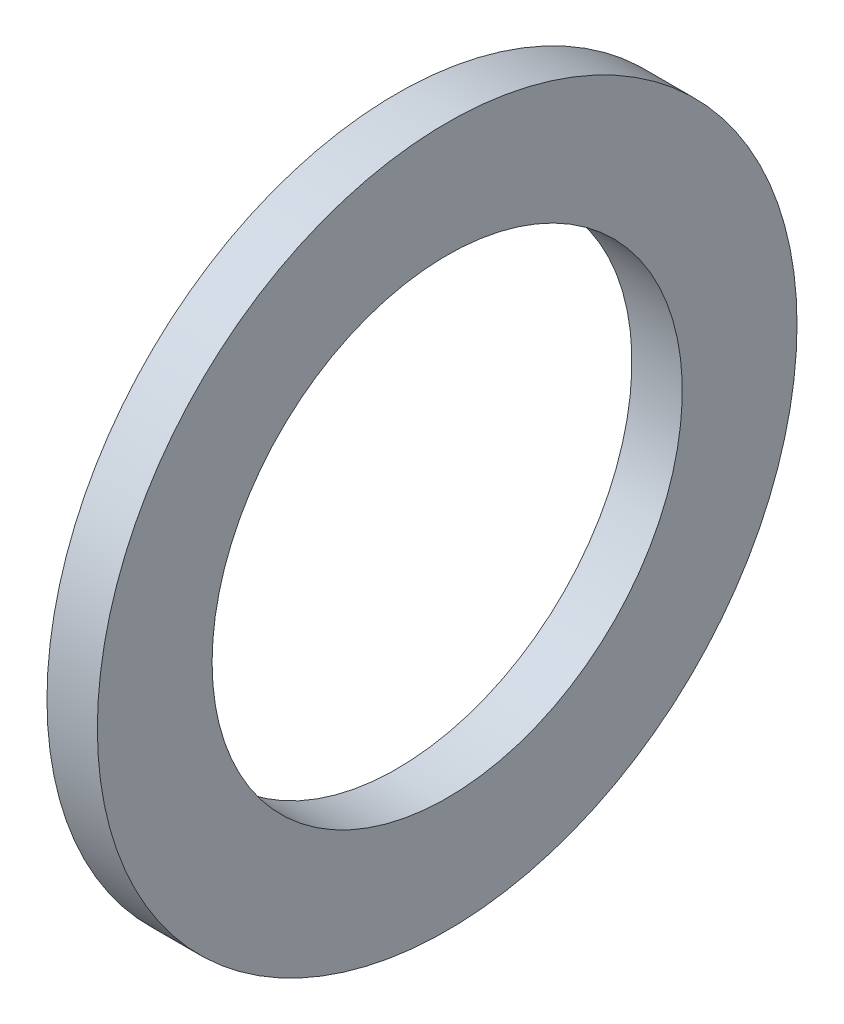
ISO-10303-21;
HEADER;
FILE_DESCRIPTION(('STEP AP214'),'2;1');
FILE_NAME('part.step','',(''),(''),'','','');
FILE_SCHEMA(('AUTOMOTIVE_DESIGN { 1 0 10303 214 1 1 1 1 }'));
ENDSEC;
DATA;
#1=APPLICATION_CONTEXT('core data for automotive mechanical design processes');
#2=APPLICATION_PROTOCOL_DEFINITION('international standard','automotive_design',2000,#1);
#3=PRODUCT_CONTEXT('',#1,'mechanical');
#4=PRODUCT('Part','Part','',(#3));
#5=PRODUCT_RELATED_PRODUCT_CATEGORY('part','',(#4));
#6=PRODUCT_DEFINITION_FORMATION('','',#4);
#7=PRODUCT_DEFINITION_CONTEXT('part definition',#1,'design');
#8=PRODUCT_DEFINITION('design','',#6,#7);
#9=PRODUCT_DEFINITION_SHAPE('','',#8);
#10=(LENGTH_UNIT() NAMED_UNIT(*) SI_UNIT(.MILLI.,.METRE.));
#11=(NAMED_UNIT(*) PLANE_ANGLE_UNIT() SI_UNIT($,.RADIAN.));
#12=(NAMED_UNIT(*) SI_UNIT($,.STERADIAN.) SOLID_ANGLE_UNIT());
#13=UNCERTAINTY_MEASURE_WITH_UNIT(LENGTH_MEASURE(1.E-05),#10,'distance_accuracy_value','');
#14=(GEOMETRIC_REPRESENTATION_CONTEXT(3) GLOBAL_UNCERTAINTY_ASSIGNED_CONTEXT((#13)) GLOBAL_UNIT_ASSIGNED_CONTEXT((#10,
#11,#12)) REPRESENTATION_CONTEXT('',''));
#15=CARTESIAN_POINT('',(0.,0.,0.));
#16=DIRECTION('',(0.,0.,1.));
#17=DIRECTION('',(1.,0.,0.));
#18=AXIS2_PLACEMENT_3D('',#15,#16,#17);
#19=CARTESIAN_POINT('',(-34.9249999999999,0.,0.));
#20=DIRECTION('',(-1.,0.,0.));
#21=DIRECTION('',(0.,0.,1.));
#22=AXIS2_PLACEMENT_3D('',#19,#20,#21);
#23=CYLINDRICAL_SURFACE('',#22,84.);
#24=CARTESIAN_POINT('',(0.,0.,0.));
#25=DIRECTION('',(-1.,0.,0.));
#26=DIRECTION('',(0.,0.,1.));
#27=AXIS2_PLACEMENT_3D('',#24,#25,#26);
#28=CIRCLE('',#27,84.);
#29=CARTESIAN_POINT('',(0.,0.,84.));
#30=VERTEX_POINT('',#29);
#31=EDGE_CURVE('E10',#30,#30,#28,.T.);
#32=ORIENTED_EDGE('',*,*,#31,.F.);
#33=EDGE_LOOP('',(#32));
#34=FACE_BOUND('',#33,.T.);
#35=CARTESIAN_POINT('',(-18.,0.,0.));
#36=DIRECTION('',(-1.,0.,0.));
#37=DIRECTION('',(0.,0.,1.));
#38=AXIS2_PLACEMENT_3D('',#35,#36,#37);
#39=CIRCLE('',#38,84.);
#40=CARTESIAN_POINT('',(-18.,0.,84.));
#41=VERTEX_POINT('',#40);
#42=EDGE_CURVE('E44',#41,#41,#39,.T.);
#43=ORIENTED_EDGE('',*,*,#42,.T.);
#44=EDGE_LOOP('',(#43));
#45=FACE_BOUND('',#44,.T.);
#46=ADVANCED_FACE('F30',(#34,#45),#23,.F.);
#47=CARTESIAN_POINT('',(0.,84.,0.));
#48=DIRECTION('',(-1.,0.,0.));
#49=DIRECTION('',(0.,0.,1.));
#50=AXIS2_PLACEMENT_3D('',#47,#48,#49);
#51=PLANE('',#50);
#52=CARTESIAN_POINT('',(0.,0.,0.));
#53=DIRECTION('',(-1.,0.,0.));
#54=DIRECTION('',(0.,0.,1.));
#55=AXIS2_PLACEMENT_3D('',#52,#53,#54);
#56=CIRCLE('',#55,125.);
#57=CARTESIAN_POINT('',(0.,0.,125.));
#58=VERTEX_POINT('',#57);
#59=EDGE_CURVE('E36',#58,#58,#56,.T.);
#60=ORIENTED_EDGE('',*,*,#59,.F.);
#61=EDGE_LOOP('',(#60));
#62=FACE_BOUND('',#61,.T.);
#63=ORIENTED_EDGE('',*,*,#31,.T.);
#64=EDGE_LOOP('',(#63));
#65=FACE_BOUND('',#64,.T.);
#66=ADVANCED_FACE('F59',(#62,#65),#51,.F.);
#67=CARTESIAN_POINT('',(-34.9249999999999,0.,0.));
#68=DIRECTION('',(-1.,0.,0.));
#69=DIRECTION('',(0.,0.,1.));
#70=AXIS2_PLACEMENT_3D('',#67,#68,#69);
#71=CYLINDRICAL_SURFACE('',#70,125.);
#72=CARTESIAN_POINT('',(-18.,0.,0.));
#73=DIRECTION('',(-1.,0.,0.));
#74=DIRECTION('',(0.,0.,1.));
#75=AXIS2_PLACEMENT_3D('',#72,#73,#74);
#76=CIRCLE('',#75,125.);
#77=CARTESIAN_POINT('',(-18.,0.,125.));
#78=VERTEX_POINT('',#77);
#79=EDGE_CURVE('E40',#78,#78,#76,.T.);
#80=ORIENTED_EDGE('',*,*,#79,.F.);
#81=EDGE_LOOP('',(#80));
#82=FACE_BOUND('',#81,.T.);
#83=ORIENTED_EDGE('',*,*,#59,.T.);
#84=EDGE_LOOP('',(#83));
#85=FACE_BOUND('',#84,.T.);
#86=ADVANCED_FACE('F54',(#82,#85),#71,.T.);
#87=CARTESIAN_POINT('',(-18.,125.,0.));
#88=DIRECTION('',(1.,0.,0.));
#89=DIRECTION('',(0.,0.,-1.));
#90=AXIS2_PLACEMENT_3D('',#87,#88,#89);
#91=PLANE('',#90);
#92=ORIENTED_EDGE('',*,*,#42,.F.);
#93=EDGE_LOOP('',(#92));
#94=FACE_BOUND('',#93,.T.);
#95=ORIENTED_EDGE('',*,*,#79,.T.);
#96=EDGE_LOOP('',(#95));
#97=FACE_BOUND('',#96,.T.);
#98=ADVANCED_FACE('F51',(#94,#97),#91,.F.);
#99=CLOSED_SHELL('',(#46,#66,#86,#98));
#100=MANIFOLD_SOLID_BREP('B2',#99);
#101=ADVANCED_BREP_SHAPE_REPRESENTATION('',(#18,#100),#14);
#102=SHAPE_DEFINITION_REPRESENTATION(#9,#101);
ENDSEC;
END-ISO-10303-21;
